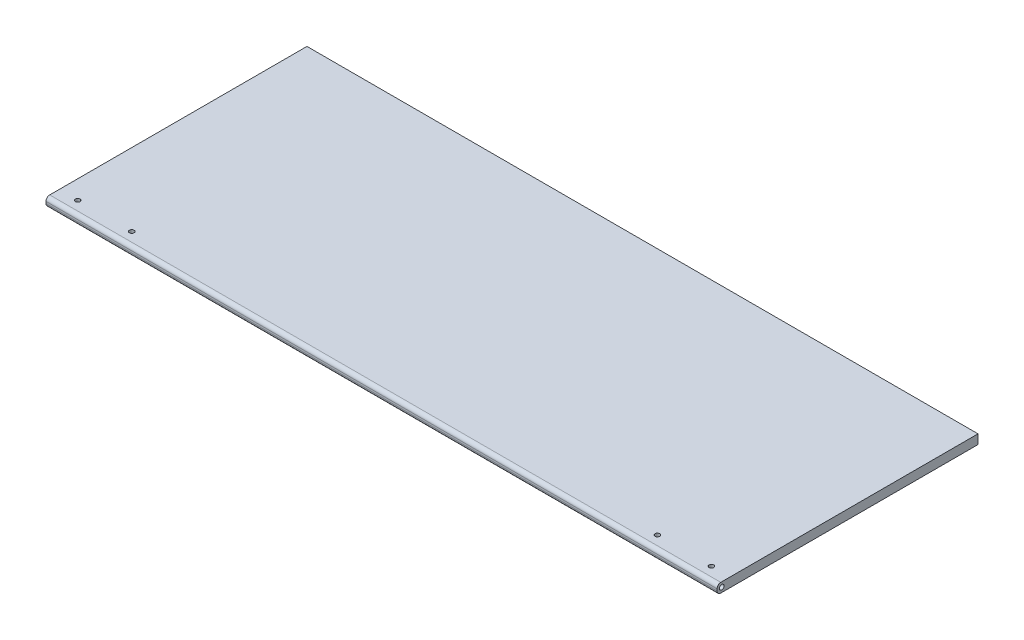
ISO-10303-21;
HEADER;
FILE_DESCRIPTION(('STEP AP214'),'2;1');
FILE_NAME('part.step','',(''),(''),'','','');
FILE_SCHEMA(('AUTOMOTIVE_DESIGN { 1 0 10303 214 1 1 1 1 }'));
ENDSEC;
DATA;
#1=APPLICATION_CONTEXT('core data for automotive mechanical design processes');
#2=APPLICATION_PROTOCOL_DEFINITION('international standard','automotive_design',2000,#1);
#3=PRODUCT_CONTEXT('',#1,'mechanical');
#4=PRODUCT('Part','Part','',(#3));
#5=PRODUCT_RELATED_PRODUCT_CATEGORY('part','',(#4));
#6=PRODUCT_DEFINITION_FORMATION('','',#4);
#7=PRODUCT_DEFINITION_CONTEXT('part definition',#1,'design');
#8=PRODUCT_DEFINITION('design','',#6,#7);
#9=PRODUCT_DEFINITION_SHAPE('','',#8);
#10=(LENGTH_UNIT() NAMED_UNIT(*) SI_UNIT(.MILLI.,.METRE.));
#11=(NAMED_UNIT(*) PLANE_ANGLE_UNIT() SI_UNIT($,.RADIAN.));
#12=(NAMED_UNIT(*) SI_UNIT($,.STERADIAN.) SOLID_ANGLE_UNIT());
#13=UNCERTAINTY_MEASURE_WITH_UNIT(LENGTH_MEASURE(1.E-05),#10,'distance_accuracy_value','');
#14=(GEOMETRIC_REPRESENTATION_CONTEXT(3) GLOBAL_UNCERTAINTY_ASSIGNED_CONTEXT((#13)) GLOBAL_UNIT_ASSIGNED_CONTEXT((#10,
#11,#12)) REPRESENTATION_CONTEXT('',''));
#15=CARTESIAN_POINT('',(0.,0.,0.));
#16=DIRECTION('',(0.,0.,1.));
#17=DIRECTION('',(1.,0.,0.));
#18=AXIS2_PLACEMENT_3D('',#15,#16,#17);
#19=CARTESIAN_POINT('',(228.6,6.35,-88.9));
#20=DIRECTION('',(-1.,0.,0.));
#21=DIRECTION('',(0.,0.,1.));
#22=AXIS2_PLACEMENT_3D('',#19,#20,#21);
#23=PLANE('',#22);
#24=CARTESIAN_POINT('',(228.6,3.175,85.725));
#25=DIRECTION('',(-1.,0.,0.));
#26=DIRECTION('',(0.,0.,1.));
#27=AXIS2_PLACEMENT_3D('',#24,#25,#26);
#28=CIRCLE('',#27,1.5875);
#29=CARTESIAN_POINT('',(228.6,3.175,87.3125));
#30=VERTEX_POINT('',#29);
#31=EDGE_CURVE('E142',#30,#30,#28,.T.);
#32=ORIENTED_EDGE('',*,*,#31,.T.);
#33=EDGE_LOOP('',(#32));
#34=FACE_BOUND('',#33,.T.);
#35=DIRECTION('',(0.,-1.,0.));
#36=VECTOR('',#35,1.);
#37=CARTESIAN_POINT('',(228.6,6.35,88.9));
#38=LINE('',#37,#36);
#39=CARTESIAN_POINT('',(228.6,3.81,88.9));
#40=VERTEX_POINT('',#39);
#41=CARTESIAN_POINT('',(228.6,2.54,88.9));
#42=VERTEX_POINT('',#41);
#43=EDGE_CURVE('E138',#40,#42,#38,.T.);
#44=ORIENTED_EDGE('',*,*,#43,.T.);
#45=CARTESIAN_POINT('',(228.6,2.54,86.36));
#46=DIRECTION('',(-1.,0.,0.));
#47=DIRECTION('',(0.,0.,1.));
#48=AXIS2_PLACEMENT_3D('',#45,#46,#47);
#49=CIRCLE('',#48,2.54);
#50=CARTESIAN_POINT('',(228.6,0.,86.36));
#51=VERTEX_POINT('',#50);
#52=EDGE_CURVE('E126',#42,#51,#49,.F.);
#53=ORIENTED_EDGE('',*,*,#52,.T.);
#54=DIRECTION('',(0.,0.,-1.));
#55=VECTOR('',#54,1.);
#56=CARTESIAN_POINT('',(228.6,0.,-88.9));
#57=LINE('',#56,#55);
#58=CARTESIAN_POINT('',(228.6,0.,-88.9));
#59=VERTEX_POINT('',#58);
#60=EDGE_CURVE('E112',#51,#59,#57,.T.);
#61=ORIENTED_EDGE('',*,*,#60,.T.);
#62=DIRECTION('',(0.,-1.,0.));
#63=VECTOR('',#62,1.);
#64=CARTESIAN_POINT('',(228.6,6.35,-88.9));
#65=LINE('',#64,#63);
#66=CARTESIAN_POINT('',(228.6,6.35,-88.9));
#67=VERTEX_POINT('',#66);
#68=EDGE_CURVE('E106',#67,#59,#65,.T.);
#69=ORIENTED_EDGE('',*,*,#68,.F.);
#70=DIRECTION('',(0.,0.,-1.));
#71=VECTOR('',#70,1.);
#72=CARTESIAN_POINT('',(228.6,6.35,-88.9));
#73=LINE('',#72,#71);
#74=CARTESIAN_POINT('',(228.6,6.35,86.36));
#75=VERTEX_POINT('',#74);
#76=EDGE_CURVE('E93',#75,#67,#73,.T.);
#77=ORIENTED_EDGE('',*,*,#76,.F.);
#78=CARTESIAN_POINT('',(228.6,3.81,86.36));
#79=DIRECTION('',(-1.,0.,0.));
#80=DIRECTION('',(0.,0.,1.));
#81=AXIS2_PLACEMENT_3D('',#78,#79,#80);
#82=CIRCLE('',#81,2.54);
#83=EDGE_CURVE('E124',#75,#40,#82,.F.);
#84=ORIENTED_EDGE('',*,*,#83,.T.);
#85=EDGE_LOOP('',(#44,#53,#61,#69,#77,#84));
#86=FACE_BOUND('',#85,.T.);
#87=ADVANCED_FACE('F37',(#34,#86),#23,.F.);
#88=CARTESIAN_POINT('',(-228.6,6.35,-88.9));
#89=DIRECTION('',(0.,0.,1.));
#90=DIRECTION('',(1.,0.,0.));
#91=AXIS2_PLACEMENT_3D('',#88,#89,#90);
#92=PLANE('',#91);
#93=DIRECTION('',(-1.,0.,0.));
#94=VECTOR('',#93,1.);
#95=CARTESIAN_POINT('',(-228.6,0.,-88.9));
#96=LINE('',#95,#94);
#97=CARTESIAN_POINT('',(-228.6,0.,-88.9));
#98=VERTEX_POINT('',#97);
#99=EDGE_CURVE('E141',#59,#98,#96,.T.);
#100=ORIENTED_EDGE('',*,*,#99,.T.);
#101=DIRECTION('',(0.,-1.,0.));
#102=VECTOR('',#101,1.);
#103=CARTESIAN_POINT('',(-228.6,6.35,-88.9));
#104=LINE('',#103,#102);
#105=CARTESIAN_POINT('',(-228.6,6.35,-88.9));
#106=VERTEX_POINT('',#105);
#107=EDGE_CURVE('E108',#106,#98,#104,.T.);
#108=ORIENTED_EDGE('',*,*,#107,.F.);
#109=DIRECTION('',(-1.,0.,0.));
#110=VECTOR('',#109,1.);
#111=CARTESIAN_POINT('',(-228.6,6.35,-88.9));
#112=LINE('',#111,#110);
#113=EDGE_CURVE('E96',#67,#106,#112,.T.);
#114=ORIENTED_EDGE('',*,*,#113,.F.);
#115=ORIENTED_EDGE('',*,*,#68,.T.);
#116=EDGE_LOOP('',(#100,#108,#114,#115));
#117=FACE_BOUND('',#116,.T.);
#118=ADVANCED_FACE('F105',(#117),#92,.F.);
#119=CARTESIAN_POINT('',(-228.6,6.35,-88.9));
#120=DIRECTION('',(1.,0.,0.));
#121=DIRECTION('',(0.,0.,-1.));
#122=AXIS2_PLACEMENT_3D('',#119,#120,#121);
#123=PLANE('',#122);
#124=CARTESIAN_POINT('',(-228.6,3.175,85.725));
#125=DIRECTION('',(-1.,0.,0.));
#126=DIRECTION('',(0.,0.,1.));
#127=AXIS2_PLACEMENT_3D('',#124,#125,#126);
#128=CIRCLE('',#127,1.5875);
#129=CARTESIAN_POINT('',(-228.6,3.175,87.3125));
#130=VERTEX_POINT('',#129);
#131=EDGE_CURVE('E146',#130,#130,#128,.T.);
#132=ORIENTED_EDGE('',*,*,#131,.F.);
#133=EDGE_LOOP('',(#132));
#134=FACE_BOUND('',#133,.T.);
#135=DIRECTION('',(0.,0.,1.));
#136=VECTOR('',#135,1.);
#137=CARTESIAN_POINT('',(-228.6,0.,-88.9));
#138=LINE('',#137,#136);
#139=CARTESIAN_POINT('',(-228.6,0.,86.36));
#140=VERTEX_POINT('',#139);
#141=EDGE_CURVE('E101',#98,#140,#138,.T.);
#142=ORIENTED_EDGE('',*,*,#141,.T.);
#143=CARTESIAN_POINT('',(-228.6,2.54,86.36));
#144=DIRECTION('',(1.,0.,0.));
#145=DIRECTION('',(0.,0.,-1.));
#146=AXIS2_PLACEMENT_3D('',#143,#144,#145);
#147=CIRCLE('',#146,2.54);
#148=CARTESIAN_POINT('',(-228.6,2.54,88.9));
#149=VERTEX_POINT('',#148);
#150=EDGE_CURVE('E45',#140,#149,#147,.F.);
#151=ORIENTED_EDGE('',*,*,#150,.T.);
#152=DIRECTION('',(0.,-1.,0.));
#153=VECTOR('',#152,1.);
#154=CARTESIAN_POINT('',(-228.6,6.35,88.9));
#155=LINE('',#154,#153);
#156=CARTESIAN_POINT('',(-228.6,3.81,88.9));
#157=VERTEX_POINT('',#156);
#158=EDGE_CURVE('E118',#157,#149,#155,.T.);
#159=ORIENTED_EDGE('',*,*,#158,.F.);
#160=CARTESIAN_POINT('',(-228.6,3.81,86.36));
#161=DIRECTION('',(1.,0.,0.));
#162=DIRECTION('',(0.,0.,-1.));
#163=AXIS2_PLACEMENT_3D('',#160,#161,#162);
#164=CIRCLE('',#163,2.54);
#165=CARTESIAN_POINT('',(-228.6,6.35,86.36));
#166=VERTEX_POINT('',#165);
#167=EDGE_CURVE('E52',#157,#166,#164,.F.);
#168=ORIENTED_EDGE('',*,*,#167,.T.);
#169=DIRECTION('',(0.,0.,1.));
#170=VECTOR('',#169,1.);
#171=CARTESIAN_POINT('',(-228.6,6.35,-88.9));
#172=LINE('',#171,#170);
#173=EDGE_CURVE('E109',#106,#166,#172,.T.);
#174=ORIENTED_EDGE('',*,*,#173,.F.);
#175=ORIENTED_EDGE('',*,*,#107,.T.);
#176=EDGE_LOOP('',(#142,#151,#159,#168,#174,#175));
#177=FACE_BOUND('',#176,.T.);
#178=ADVANCED_FACE('F131',(#134,#177),#123,.F.);
#179=CARTESIAN_POINT('',(-228.6,6.35,88.9));
#180=DIRECTION('',(0.,0.,-1.));
#181=DIRECTION('',(-1.,0.,0.));
#182=AXIS2_PLACEMENT_3D('',#179,#180,#181);
#183=PLANE('',#182);
#184=ORIENTED_EDGE('',*,*,#158,.T.);
#185=DIRECTION('',(1.,0.,0.));
#186=VECTOR('',#185,1.);
#187=CARTESIAN_POINT('',(-228.6,2.54,88.9));
#188=LINE('',#187,#186);
#189=EDGE_CURVE('E116',#149,#42,#188,.T.);
#190=ORIENTED_EDGE('',*,*,#189,.T.);
#191=ORIENTED_EDGE('',*,*,#43,.F.);
#192=DIRECTION('',(1.,0.,0.));
#193=VECTOR('',#192,1.);
#194=CARTESIAN_POINT('',(-228.6,3.81,88.9));
#195=LINE('',#194,#193);
#196=EDGE_CURVE('E114',#40,#157,#195,.F.);
#197=ORIENTED_EDGE('',*,*,#196,.T.);
#198=EDGE_LOOP('',(#184,#190,#191,#197));
#199=FACE_BOUND('',#198,.T.);
#200=ADVANCED_FACE('F135',(#199),#183,.F.);
#201=CARTESIAN_POINT('',(0.,6.35,0.));
#202=DIRECTION('',(0.,1.,0.));
#203=DIRECTION('',(0.,0.,1.));
#204=AXIS2_PLACEMENT_3D('',#201,#202,#203);
#205=PLANE('',#204);
#206=CARTESIAN_POINT('',(179.07,6.35,80.01));
#207=DIRECTION('',(0.,1.,0.));
#208=DIRECTION('',(0.,0.,-1.));
#209=AXIS2_PLACEMENT_3D('',#206,#207,#208);
#210=CIRCLE('',#209,1.58750000026392);
#211=CARTESIAN_POINT('',(179.07,6.35,78.4224999997361));
#212=VERTEX_POINT('',#211);
#213=EDGE_CURVE('E199',#212,#212,#210,.T.);
#214=ORIENTED_EDGE('',*,*,#213,.F.);
#215=EDGE_LOOP('',(#214));
#216=FACE_BOUND('',#215,.T.);
#217=CARTESIAN_POINT('',(215.9,6.35,80.01));
#218=DIRECTION('',(0.,1.,0.));
#219=DIRECTION('',(0.,0.,-1.));
#220=AXIS2_PLACEMENT_3D('',#217,#218,#219);
#221=CIRCLE('',#220,1.58750000026392);
#222=CARTESIAN_POINT('',(215.9,6.35,78.4224999997361));
#223=VERTEX_POINT('',#222);
#224=EDGE_CURVE('E203',#223,#223,#221,.T.);
#225=ORIENTED_EDGE('',*,*,#224,.F.);
#226=EDGE_LOOP('',(#225));
#227=FACE_BOUND('',#226,.T.);
#228=CARTESIAN_POINT('',(-179.07,6.35,80.01));
#229=DIRECTION('',(0.,-1.,0.));
#230=DIRECTION('',(0.,0.,-1.));
#231=AXIS2_PLACEMENT_3D('',#228,#229,#230);
#232=CIRCLE('',#231,1.58750000026392);
#233=CARTESIAN_POINT('',(-179.07,6.35,78.4224999997361));
#234=VERTEX_POINT('',#233);
#235=EDGE_CURVE('E213',#234,#234,#232,.T.);
#236=ORIENTED_EDGE('',*,*,#235,.T.);
#237=EDGE_LOOP('',(#236));
#238=FACE_BOUND('',#237,.T.);
#239=CARTESIAN_POINT('',(-215.9,6.35,80.01));
#240=DIRECTION('',(0.,-1.,0.));
#241=DIRECTION('',(0.,0.,-1.));
#242=AXIS2_PLACEMENT_3D('',#239,#240,#241);
#243=CIRCLE('',#242,1.58750000026392);
#244=CARTESIAN_POINT('',(-215.9,6.35,78.4224999997361));
#245=VERTEX_POINT('',#244);
#246=EDGE_CURVE('E219',#245,#245,#243,.T.);
#247=ORIENTED_EDGE('',*,*,#246,.T.);
#248=EDGE_LOOP('',(#247));
#249=FACE_BOUND('',#248,.T.);
#250=ORIENTED_EDGE('',*,*,#173,.T.);
#251=DIRECTION('',(1.,0.,0.));
#252=VECTOR('',#251,1.);
#253=CARTESIAN_POINT('',(228.6,6.35,86.36));
#254=LINE('',#253,#252);
#255=EDGE_CURVE('E11',#166,#75,#254,.T.);
#256=ORIENTED_EDGE('',*,*,#255,.T.);
#257=ORIENTED_EDGE('',*,*,#76,.T.);
#258=ORIENTED_EDGE('',*,*,#113,.T.);
#259=EDGE_LOOP('',(#250,#256,#257,#258));
#260=FACE_BOUND('',#259,.T.);
#261=ADVANCED_FACE('F95',(#216,#227,#238,#249,#260),#205,.T.);
#262=CARTESIAN_POINT('',(0.,0.,0.));
#263=DIRECTION('',(0.,1.,0.));
#264=DIRECTION('',(0.,0.,1.));
#265=AXIS2_PLACEMENT_3D('',#262,#263,#264);
#266=PLANE('',#265);
#267=CARTESIAN_POINT('',(179.07,0.,80.01));
#268=DIRECTION('',(0.,1.,0.));
#269=DIRECTION('',(0.,0.,-1.));
#270=AXIS2_PLACEMENT_3D('',#267,#268,#269);
#271=CIRCLE('',#270,1.58750000026392);
#272=CARTESIAN_POINT('',(179.07,0.,78.4224999997361));
#273=VERTEX_POINT('',#272);
#274=EDGE_CURVE('E202',#273,#273,#271,.T.);
#275=ORIENTED_EDGE('',*,*,#274,.T.);
#276=EDGE_LOOP('',(#275));
#277=FACE_BOUND('',#276,.T.);
#278=CARTESIAN_POINT('',(215.9,0.,80.01));
#279=DIRECTION('',(0.,1.,0.));
#280=DIRECTION('',(0.,0.,-1.));
#281=AXIS2_PLACEMENT_3D('',#278,#279,#280);
#282=CIRCLE('',#281,1.58750000026392);
#283=CARTESIAN_POINT('',(215.9,0.,78.4224999997361));
#284=VERTEX_POINT('',#283);
#285=EDGE_CURVE('E208',#284,#284,#282,.T.);
#286=ORIENTED_EDGE('',*,*,#285,.T.);
#287=EDGE_LOOP('',(#286));
#288=FACE_BOUND('',#287,.T.);
#289=CARTESIAN_POINT('',(-179.07,0.,80.01));
#290=DIRECTION('',(0.,-1.,0.));
#291=DIRECTION('',(0.,0.,-1.));
#292=AXIS2_PLACEMENT_3D('',#289,#290,#291);
#293=CIRCLE('',#292,1.58750000026392);
#294=CARTESIAN_POINT('',(-179.07,0.,78.4224999997361));
#295=VERTEX_POINT('',#294);
#296=EDGE_CURVE('E216',#295,#295,#293,.T.);
#297=ORIENTED_EDGE('',*,*,#296,.F.);
#298=EDGE_LOOP('',(#297));
#299=FACE_BOUND('',#298,.T.);
#300=CARTESIAN_POINT('',(-215.9,0.,80.01));
#301=DIRECTION('',(0.,-1.,0.));
#302=DIRECTION('',(0.,0.,-1.));
#303=AXIS2_PLACEMENT_3D('',#300,#301,#302);
#304=CIRCLE('',#303,1.58750000026392);
#305=CARTESIAN_POINT('',(-215.9,0.,78.4224999997361));
#306=VERTEX_POINT('',#305);
#307=EDGE_CURVE('E205',#306,#306,#304,.T.);
#308=ORIENTED_EDGE('',*,*,#307,.F.);
#309=EDGE_LOOP('',(#308));
#310=FACE_BOUND('',#309,.T.);
#311=ORIENTED_EDGE('',*,*,#60,.F.);
#312=DIRECTION('',(1.,0.,0.));
#313=VECTOR('',#312,1.);
#314=CARTESIAN_POINT('',(0.,0.,86.36));
#315=LINE('',#314,#313);
#316=EDGE_CURVE('E60',#51,#140,#315,.F.);
#317=ORIENTED_EDGE('',*,*,#316,.T.);
#318=ORIENTED_EDGE('',*,*,#141,.F.);
#319=ORIENTED_EDGE('',*,*,#99,.F.);
#320=EDGE_LOOP('',(#311,#317,#318,#319));
#321=FACE_BOUND('',#320,.T.);
#322=ADVANCED_FACE('F140',(#277,#288,#299,#310,#321),#266,.F.);
#323=CARTESIAN_POINT('',(228.6,3.175,85.725));
#324=DIRECTION('',(-1.,0.,0.));
#325=DIRECTION('',(0.,0.,1.));
#326=AXIS2_PLACEMENT_3D('',#323,#324,#325);
#327=CYLINDRICAL_SURFACE('',#326,1.5875);
#328=ORIENTED_EDGE('',*,*,#31,.F.);
#329=EDGE_LOOP('',(#328));
#330=FACE_BOUND('',#329,.T.);
#331=ORIENTED_EDGE('',*,*,#131,.T.);
#332=EDGE_LOOP('',(#331));
#333=FACE_BOUND('',#332,.T.);
#334=ADVANCED_FACE('F161',(#330,#333),#327,.F.);
#335=CARTESIAN_POINT('',(-228.6,2.54,86.36));
#336=DIRECTION('',(1.,0.,0.));
#337=DIRECTION('',(0.,0.,-1.));
#338=AXIS2_PLACEMENT_3D('',#335,#336,#337);
#339=CYLINDRICAL_SURFACE('',#338,2.54);
#340=ORIENTED_EDGE('',*,*,#150,.F.);
#341=ORIENTED_EDGE('',*,*,#316,.F.);
#342=ORIENTED_EDGE('',*,*,#52,.F.);
#343=ORIENTED_EDGE('',*,*,#189,.F.);
#344=EDGE_LOOP('',(#340,#341,#342,#343));
#345=FACE_BOUND('',#344,.T.);
#346=ADVANCED_FACE('F139',(#345),#339,.T.);
#347=CARTESIAN_POINT('',(0.,3.81,86.36));
#348=DIRECTION('',(-1.,0.,0.));
#349=DIRECTION('',(0.,0.,1.));
#350=AXIS2_PLACEMENT_3D('',#347,#348,#349);
#351=CYLINDRICAL_SURFACE('',#350,2.54);
#352=ORIENTED_EDGE('',*,*,#167,.F.);
#353=ORIENTED_EDGE('',*,*,#196,.F.);
#354=ORIENTED_EDGE('',*,*,#83,.F.);
#355=ORIENTED_EDGE('',*,*,#255,.F.);
#356=EDGE_LOOP('',(#352,#353,#354,#355));
#357=FACE_BOUND('',#356,.T.);
#358=ADVANCED_FACE('F39',(#357),#351,.T.);
#359=CARTESIAN_POINT('',(-215.9,6.35,80.01));
#360=DIRECTION('',(0.,-1.,0.));
#361=DIRECTION('',(0.,0.,-1.));
#362=AXIS2_PLACEMENT_3D('',#359,#360,#361);
#363=CYLINDRICAL_SURFACE('',#362,1.58750000026392);
#364=ORIENTED_EDGE('',*,*,#246,.F.);
#365=EDGE_LOOP('',(#364));
#366=FACE_BOUND('',#365,.T.);
#367=ORIENTED_EDGE('',*,*,#307,.T.);
#368=EDGE_LOOP('',(#367));
#369=FACE_BOUND('',#368,.T.);
#370=ADVANCED_FACE('F153',(#366,#369),#363,.F.);
#371=CARTESIAN_POINT('',(-179.07,6.35,80.01));
#372=DIRECTION('',(0.,-1.,0.));
#373=DIRECTION('',(0.,0.,-1.));
#374=AXIS2_PLACEMENT_3D('',#371,#372,#373);
#375=CYLINDRICAL_SURFACE('',#374,1.58750000026392);
#376=ORIENTED_EDGE('',*,*,#235,.F.);
#377=EDGE_LOOP('',(#376));
#378=FACE_BOUND('',#377,.T.);
#379=ORIENTED_EDGE('',*,*,#296,.T.);
#380=EDGE_LOOP('',(#379));
#381=FACE_BOUND('',#380,.T.);
#382=ADVANCED_FACE('F158',(#378,#381),#375,.F.);
#383=CARTESIAN_POINT('',(215.9,6.35,80.01));
#384=DIRECTION('',(0.,-1.,0.));
#385=DIRECTION('',(0.,0.,-1.));
#386=AXIS2_PLACEMENT_3D('',#383,#384,#385);
#387=CYLINDRICAL_SURFACE('',#386,1.58750000026392);
#388=ORIENTED_EDGE('',*,*,#224,.T.);
#389=EDGE_LOOP('',(#388));
#390=FACE_BOUND('',#389,.T.);
#391=ORIENTED_EDGE('',*,*,#285,.F.);
#392=EDGE_LOOP('',(#391));
#393=FACE_BOUND('',#392,.T.);
#394=ADVANCED_FACE('F186',(#390,#393),#387,.F.);
#395=CARTESIAN_POINT('',(179.07,6.35,80.01));
#396=DIRECTION('',(0.,-1.,0.));
#397=DIRECTION('',(0.,0.,-1.));
#398=AXIS2_PLACEMENT_3D('',#395,#396,#397);
#399=CYLINDRICAL_SURFACE('',#398,1.58750000026392);
#400=ORIENTED_EDGE('',*,*,#213,.T.);
#401=EDGE_LOOP('',(#400));
#402=FACE_BOUND('',#401,.T.);
#403=ORIENTED_EDGE('',*,*,#274,.F.);
#404=EDGE_LOOP('',(#403));
#405=FACE_BOUND('',#404,.T.);
#406=ADVANCED_FACE('F190',(#402,#405),#399,.F.);
#407=CLOSED_SHELL('',(#87,#118,#178,#200,#261,#322,#334,#346,#358,#370,#382,#394,#406));
#408=MANIFOLD_SOLID_BREP('B2',#407);
#409=ADVANCED_BREP_SHAPE_REPRESENTATION('',(#18,#408),#14);
#410=SHAPE_DEFINITION_REPRESENTATION(#9,#409);
ENDSEC;
END-ISO-10303-21;
